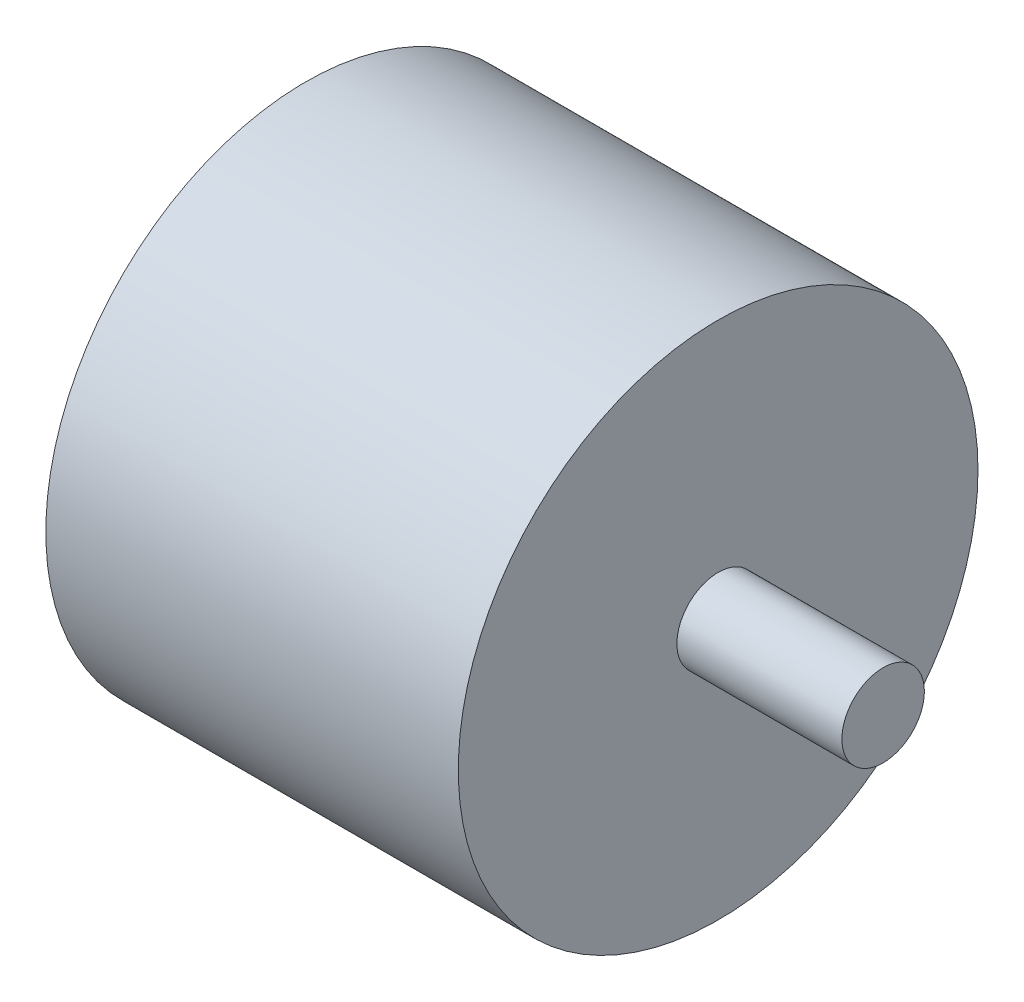
ISO-10303-21;
HEADER;
FILE_DESCRIPTION(('STEP AP214'),'2;1');
FILE_NAME('part.step','',(''),(''),'','','');
FILE_SCHEMA(('AUTOMOTIVE_DESIGN { 1 0 10303 214 1 1 1 1 }'));
ENDSEC;
DATA;
#1=APPLICATION_CONTEXT('core data for automotive mechanical design processes');
#2=APPLICATION_PROTOCOL_DEFINITION('international standard','automotive_design',2000,#1);
#3=PRODUCT_CONTEXT('',#1,'mechanical');
#4=PRODUCT('Part','Part','',(#3));
#5=PRODUCT_RELATED_PRODUCT_CATEGORY('part','',(#4));
#6=PRODUCT_DEFINITION_FORMATION('','',#4);
#7=PRODUCT_DEFINITION_CONTEXT('part definition',#1,'design');
#8=PRODUCT_DEFINITION('design','',#6,#7);
#9=PRODUCT_DEFINITION_SHAPE('','',#8);
#10=(LENGTH_UNIT() NAMED_UNIT(*) SI_UNIT(.MILLI.,.METRE.));
#11=(NAMED_UNIT(*) PLANE_ANGLE_UNIT() SI_UNIT($,.RADIAN.));
#12=(NAMED_UNIT(*) SI_UNIT($,.STERADIAN.) SOLID_ANGLE_UNIT());
#13=UNCERTAINTY_MEASURE_WITH_UNIT(LENGTH_MEASURE(1.E-05),#10,'distance_accuracy_value','');
#14=(GEOMETRIC_REPRESENTATION_CONTEXT(3) GLOBAL_UNCERTAINTY_ASSIGNED_CONTEXT((#13)) GLOBAL_UNIT_ASSIGNED_CONTEXT((#10,
#11,#12)) REPRESENTATION_CONTEXT('',''));
#15=CARTESIAN_POINT('',(0.,0.,0.));
#16=DIRECTION('',(0.,0.,1.));
#17=DIRECTION('',(1.,0.,0.));
#18=AXIS2_PLACEMENT_3D('',#15,#16,#17);
#19=CARTESIAN_POINT('',(25.,0.,0.));
#20=DIRECTION('',(-1.,0.,0.));
#21=DIRECTION('',(0.,0.,1.));
#22=AXIS2_PLACEMENT_3D('',#19,#20,#21);
#23=CYLINDRICAL_SURFACE('',#22,31.5);
#24=CARTESIAN_POINT('',(25.,0.,0.));
#25=DIRECTION('',(1.,0.,0.));
#26=DIRECTION('',(0.,0.,-1.));
#27=AXIS2_PLACEMENT_3D('',#24,#25,#26);
#28=CIRCLE('',#27,31.5);
#29=CARTESIAN_POINT('',(25.,0.,-31.5));
#30=VERTEX_POINT('',#29);
#31=EDGE_CURVE('E39',#30,#30,#28,.T.);
#32=ORIENTED_EDGE('',*,*,#31,.F.);
#33=EDGE_LOOP('',(#32));
#34=FACE_BOUND('',#33,.T.);
#35=CARTESIAN_POINT('',(-25.,0.,0.));
#36=DIRECTION('',(1.,0.,0.));
#37=DIRECTION('',(0.,0.,-1.));
#38=AXIS2_PLACEMENT_3D('',#35,#36,#37);
#39=CIRCLE('',#38,31.5);
#40=CARTESIAN_POINT('',(-25.,0.,-31.5));
#41=VERTEX_POINT('',#40);
#42=EDGE_CURVE('E35',#41,#41,#39,.T.);
#43=ORIENTED_EDGE('',*,*,#42,.T.);
#44=EDGE_LOOP('',(#43));
#45=FACE_BOUND('',#44,.T.);
#46=ADVANCED_FACE('F32',(#34,#45),#23,.T.);
#47=CARTESIAN_POINT('',(25.,0.,0.));
#48=DIRECTION('',(1.,0.,0.));
#49=DIRECTION('',(0.,0.,-1.));
#50=AXIS2_PLACEMENT_3D('',#47,#48,#49);
#51=PLANE('',#50);
#52=CARTESIAN_POINT('',(25.,0.,0.));
#53=DIRECTION('',(1.,0.,0.));
#54=DIRECTION('',(0.,0.,-1.));
#55=AXIS2_PLACEMENT_3D('',#52,#53,#54);
#56=CIRCLE('',#55,5.);
#57=CARTESIAN_POINT('',(25.,0.,-5.));
#58=VERTEX_POINT('',#57);
#59=EDGE_CURVE('E10',#58,#58,#56,.T.);
#60=ORIENTED_EDGE('',*,*,#59,.F.);
#61=EDGE_LOOP('',(#60));
#62=FACE_BOUND('',#61,.T.);
#63=ORIENTED_EDGE('',*,*,#31,.T.);
#64=EDGE_LOOP('',(#63));
#65=FACE_BOUND('',#64,.T.);
#66=ADVANCED_FACE('F73',(#62,#65),#51,.T.);
#67=CARTESIAN_POINT('',(-25.,0.,0.));
#68=DIRECTION('',(1.,0.,0.));
#69=DIRECTION('',(0.,0.,-1.));
#70=AXIS2_PLACEMENT_3D('',#67,#68,#69);
#71=PLANE('',#70);
#72=CARTESIAN_POINT('',(-25.,0.,0.));
#73=DIRECTION('',(1.,0.,0.));
#74=DIRECTION('',(0.,0.,-1.));
#75=AXIS2_PLACEMENT_3D('',#72,#73,#74);
#76=CIRCLE('',#75,26.5);
#77=CARTESIAN_POINT('',(-25.,0.,-26.5));
#78=VERTEX_POINT('',#77);
#79=EDGE_CURVE('E50',#78,#78,#76,.T.);
#80=ORIENTED_EDGE('',*,*,#79,.T.);
#81=EDGE_LOOP('',(#80));
#82=FACE_BOUND('',#81,.T.);
#83=ORIENTED_EDGE('',*,*,#42,.F.);
#84=EDGE_LOOP('',(#83));
#85=FACE_BOUND('',#84,.T.);
#86=ADVANCED_FACE('F78',(#82,#85),#71,.F.);
#87=CARTESIAN_POINT('',(25.,0.,0.));
#88=DIRECTION('',(-1.,0.,0.));
#89=DIRECTION('',(0.,0.,1.));
#90=AXIS2_PLACEMENT_3D('',#87,#88,#89);
#91=CYLINDRICAL_SURFACE('',#90,26.5);
#92=CARTESIAN_POINT('',(20.,0.,0.));
#93=DIRECTION('',(1.,0.,0.));
#94=DIRECTION('',(0.,0.,-1.));
#95=AXIS2_PLACEMENT_3D('',#92,#93,#94);
#96=CIRCLE('',#95,26.5);
#97=CARTESIAN_POINT('',(20.,0.,-26.5));
#98=VERTEX_POINT('',#97);
#99=EDGE_CURVE('E47',#98,#98,#96,.T.);
#100=ORIENTED_EDGE('',*,*,#99,.T.);
#101=EDGE_LOOP('',(#100));
#102=FACE_BOUND('',#101,.T.);
#103=ORIENTED_EDGE('',*,*,#79,.F.);
#104=EDGE_LOOP('',(#103));
#105=FACE_BOUND('',#104,.T.);
#106=ADVANCED_FACE('F68',(#102,#105),#91,.F.);
#107=CARTESIAN_POINT('',(20.,0.,0.));
#108=DIRECTION('',(1.,0.,0.));
#109=DIRECTION('',(0.,0.,-1.));
#110=AXIS2_PLACEMENT_3D('',#107,#108,#109);
#111=PLANE('',#110);
#112=ORIENTED_EDGE('',*,*,#99,.F.);
#113=EDGE_LOOP('',(#112));
#114=FACE_BOUND('',#113,.T.);
#115=ADVANCED_FACE('F61',(#114),#111,.F.);
#116=CARTESIAN_POINT('',(45.,0.,0.));
#117=DIRECTION('',(-1.,0.,0.));
#118=DIRECTION('',(0.,0.,1.));
#119=AXIS2_PLACEMENT_3D('',#116,#117,#118);
#120=CYLINDRICAL_SURFACE('',#119,5.);
#121=CARTESIAN_POINT('',(45.,0.,0.));
#122=DIRECTION('',(1.,0.,0.));
#123=DIRECTION('',(0.,0.,-1.));
#124=AXIS2_PLACEMENT_3D('',#121,#122,#123);
#125=CIRCLE('',#124,5.);
#126=CARTESIAN_POINT('',(45.,0.,-5.));
#127=VERTEX_POINT('',#126);
#128=EDGE_CURVE('E46',#127,#127,#125,.T.);
#129=ORIENTED_EDGE('',*,*,#128,.F.);
#130=EDGE_LOOP('',(#129));
#131=FACE_BOUND('',#130,.T.);
#132=ORIENTED_EDGE('',*,*,#59,.T.);
#133=EDGE_LOOP('',(#132));
#134=FACE_BOUND('',#133,.T.);
#135=ADVANCED_FACE('F59',(#131,#134),#120,.T.);
#136=CARTESIAN_POINT('',(45.,0.,0.));
#137=DIRECTION('',(1.,0.,0.));
#138=DIRECTION('',(0.,0.,-1.));
#139=AXIS2_PLACEMENT_3D('',#136,#137,#138);
#140=PLANE('',#139);
#141=ORIENTED_EDGE('',*,*,#128,.T.);
#142=EDGE_LOOP('',(#141));
#143=FACE_BOUND('',#142,.T.);
#144=ADVANCED_FACE('F57',(#143),#140,.T.);
#145=CLOSED_SHELL('',(#46,#66,#86,#106,#115,#135,#144));
#146=MANIFOLD_SOLID_BREP('B2',#145);
#147=ADVANCED_BREP_SHAPE_REPRESENTATION('',(#18,#146),#14);
#148=SHAPE_DEFINITION_REPRESENTATION(#9,#147);
ENDSEC;
END-ISO-10303-21;
